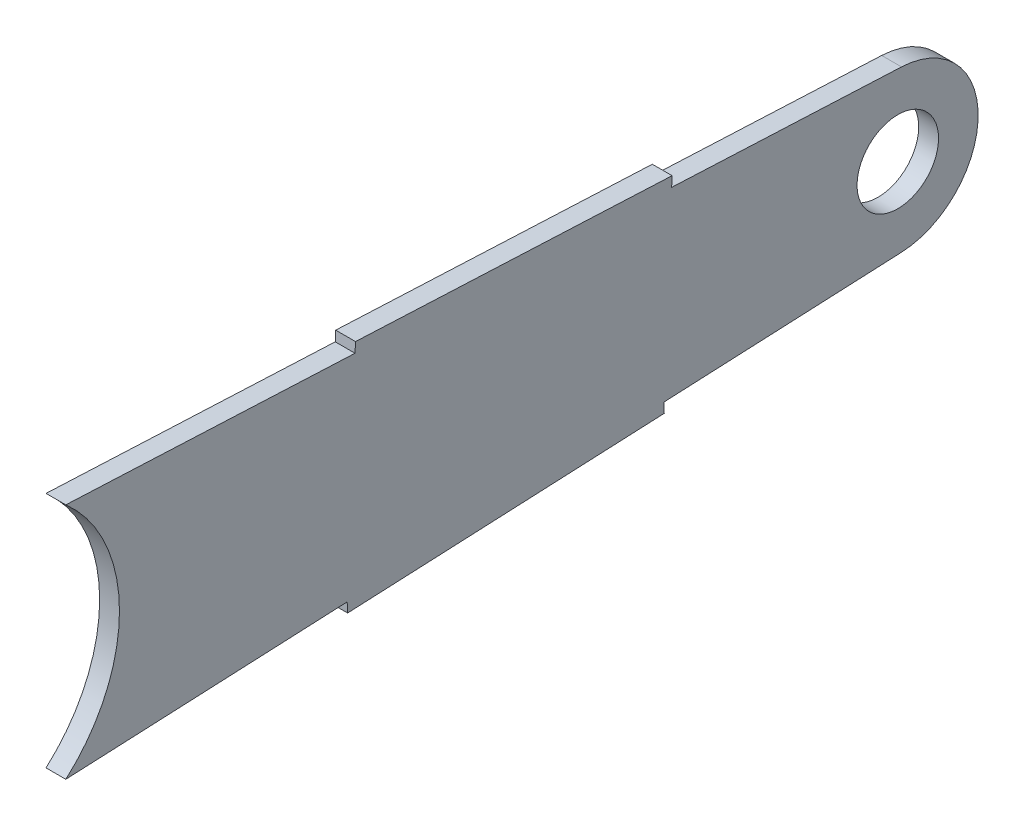
ISO-10303-21;
HEADER;
FILE_DESCRIPTION(('STEP AP214'),'2;1');
FILE_NAME('part.step','',(''),(''),'','','');
FILE_SCHEMA(('AUTOMOTIVE_DESIGN { 1 0 10303 214 1 1 1 1 }'));
ENDSEC;
DATA;
#1=APPLICATION_CONTEXT('core data for automotive mechanical design processes');
#2=APPLICATION_PROTOCOL_DEFINITION('international standard','automotive_design',2000,#1);
#3=PRODUCT_CONTEXT('',#1,'mechanical');
#4=PRODUCT('Part','Part','',(#3));
#5=PRODUCT_RELATED_PRODUCT_CATEGORY('part','',(#4));
#6=PRODUCT_DEFINITION_FORMATION('','',#4);
#7=PRODUCT_DEFINITION_CONTEXT('part definition',#1,'design');
#8=PRODUCT_DEFINITION('design','',#6,#7);
#9=PRODUCT_DEFINITION_SHAPE('','',#8);
#10=(LENGTH_UNIT() NAMED_UNIT(*) SI_UNIT(.MILLI.,.METRE.));
#11=(NAMED_UNIT(*) PLANE_ANGLE_UNIT() SI_UNIT($,.RADIAN.));
#12=(NAMED_UNIT(*) SI_UNIT($,.STERADIAN.) SOLID_ANGLE_UNIT());
#13=UNCERTAINTY_MEASURE_WITH_UNIT(LENGTH_MEASURE(1.E-05),#10,'distance_accuracy_value','');
#14=(GEOMETRIC_REPRESENTATION_CONTEXT(3) GLOBAL_UNCERTAINTY_ASSIGNED_CONTEXT((#13)) GLOBAL_UNIT_ASSIGNED_CONTEXT((#10,
#11,#12)) REPRESENTATION_CONTEXT('',''));
#15=CARTESIAN_POINT('',(0.,0.,0.));
#16=DIRECTION('',(0.,0.,1.));
#17=DIRECTION('',(1.,0.,0.));
#18=AXIS2_PLACEMENT_3D('',#15,#16,#17);
#19=CARTESIAN_POINT('',(0.79375,0.,0.));
#20=DIRECTION('',(-1.,0.,0.));
#21=DIRECTION('',(0.,0.,1.));
#22=AXIS2_PLACEMENT_3D('',#19,#20,#21);
#23=CYLINDRICAL_SURFACE('',#22,3.2639);
#24=CARTESIAN_POINT('',(0.79375,0.,0.));
#25=DIRECTION('',(1.,0.,0.));
#26=DIRECTION('',(0.,0.,-1.));
#27=AXIS2_PLACEMENT_3D('',#24,#25,#26);
#28=CIRCLE('',#27,3.2639);
#29=CARTESIAN_POINT('',(0.79375,0.,-3.2639));
#30=VERTEX_POINT('',#29);
#31=EDGE_CURVE('E203',#30,#30,#28,.T.);
#32=ORIENTED_EDGE('',*,*,#31,.T.);
#33=EDGE_LOOP('',(#32));
#34=FACE_BOUND('',#33,.T.);
#35=CARTESIAN_POINT('',(-0.79375,0.,0.));
#36=DIRECTION('',(1.,0.,0.));
#37=DIRECTION('',(0.,0.,-1.));
#38=AXIS2_PLACEMENT_3D('',#35,#36,#37);
#39=CIRCLE('',#38,3.2639);
#40=CARTESIAN_POINT('',(-0.79375,0.,-3.2639));
#41=VERTEX_POINT('',#40);
#42=EDGE_CURVE('E204',#41,#41,#39,.T.);
#43=ORIENTED_EDGE('',*,*,#42,.F.);
#44=EDGE_LOOP('',(#43));
#45=FACE_BOUND('',#44,.T.);
#46=ADVANCED_FACE('F86',(#34,#45),#23,.F.);
#47=CARTESIAN_POINT('',(0.79375,-6.43204436244265,-0.29704970892038));
#48=DIRECTION('',(0.,-0.998935278144194,-0.0461336111634565));
#49=DIRECTION('',(0.,0.0461336111634565,-0.998935278144194));
#50=AXIS2_PLACEMENT_3D('',#47,#48,#49);
#51=PLANE('',#50);
#52=DIRECTION('',(0.,-0.0461336111634565,0.998935278144194));
#53=VECTOR('',#52,1.);
#54=CARTESIAN_POINT('',(-0.79375,-6.43204436244265,-0.29704970892038));
#55=LINE('',#54,#53);
#56=CARTESIAN_POINT('',(-0.79375,-8.48362010179886,44.1259063559421));
#57=VERTEX_POINT('',#56);
#58=CARTESIAN_POINT('',(-0.79375,-9.52500000000001,66.675));
#59=VERTEX_POINT('',#58);
#60=EDGE_CURVE('E222',#57,#59,#55,.T.);
#61=ORIENTED_EDGE('',*,*,#60,.F.);
#62=DIRECTION('',(-1.,0.,0.));
#63=VECTOR('',#62,1.);
#64=CARTESIAN_POINT('',(0.79375,-8.48362010179886,44.1259063559421));
#65=LINE('',#64,#63);
#66=CARTESIAN_POINT('',(0.79375,-8.48362010179886,44.1259063559421));
#67=VERTEX_POINT('',#66);
#68=EDGE_CURVE('E96',#67,#57,#65,.T.);
#69=ORIENTED_EDGE('',*,*,#68,.F.);
#70=DIRECTION('',(0.,-0.0461336111634565,0.998935278144194));
#71=VECTOR('',#70,1.);
#72=CARTESIAN_POINT('',(0.79375,-6.43204436244265,-0.29704970892038));
#73=LINE('',#72,#71);
#74=CARTESIAN_POINT('',(0.79375,-9.52500000000001,66.675));
#75=VERTEX_POINT('',#74);
#76=EDGE_CURVE('E245',#67,#75,#73,.T.);
#77=ORIENTED_EDGE('',*,*,#76,.T.);
#78=DIRECTION('',(-1.,0.,0.));
#79=VECTOR('',#78,1.);
#80=CARTESIAN_POINT('',(0.79375,-9.52500000000001,66.675));
#81=LINE('',#80,#79);
#82=EDGE_CURVE('E12',#75,#59,#81,.T.);
#83=ORIENTED_EDGE('',*,*,#82,.T.);
#84=EDGE_LOOP('',(#61,#69,#77,#83));
#85=FACE_BOUND('',#84,.T.);
#86=ADVANCED_FACE('F262',(#85),#51,.T.);
#87=CARTESIAN_POINT('',(0.79375,-2.05157573935619,44.4229560648625));
#88=DIRECTION('',(0.,-0.046133611163456,0.998935278144194));
#89=DIRECTION('',(0.,-0.998935278144194,-0.046133611163456));
#90=AXIS2_PLACEMENT_3D('',#87,#88,#89);
#91=PLANE('',#90);
#92=DIRECTION('',(0.,0.998935278144194,0.046133611163456));
#93=VECTOR('',#92,1.);
#94=CARTESIAN_POINT('',(-0.79375,-2.05157573935619,44.4229560648625));
#95=LINE('',#94,#93);
#96=CARTESIAN_POINT('',(-0.79375,-9.27737010179887,44.0892487719503));
#97=VERTEX_POINT('',#96);
#98=EDGE_CURVE('E219',#97,#57,#95,.T.);
#99=ORIENTED_EDGE('',*,*,#98,.F.);
#100=DIRECTION('',(-1.,0.,0.));
#101=VECTOR('',#100,1.);
#102=CARTESIAN_POINT('',(0.79375,-9.27737010179887,44.0892487719503));
#103=LINE('',#102,#101);
#104=CARTESIAN_POINT('',(0.79375,-9.27737010179887,44.0892487719503));
#105=VERTEX_POINT('',#104);
#106=EDGE_CURVE('E185',#105,#97,#103,.T.);
#107=ORIENTED_EDGE('',*,*,#106,.F.);
#108=DIRECTION('',(0.,0.998935278144194,0.046133611163456));
#109=VECTOR('',#108,1.);
#110=CARTESIAN_POINT('',(0.79375,-2.05157573935619,44.4229560648625));
#111=LINE('',#110,#109);
#112=EDGE_CURVE('E242',#105,#67,#111,.T.);
#113=ORIENTED_EDGE('',*,*,#112,.T.);
#114=ORIENTED_EDGE('',*,*,#68,.T.);
#115=EDGE_LOOP('',(#99,#107,#113,#114));
#116=FACE_BOUND('',#115,.T.);
#117=ADVANCED_FACE('F267',(#116),#91,.T.);
#118=CARTESIAN_POINT('',(0.79375,-7.22579436244265,-0.333707292912232));
#119=DIRECTION('',(0.,0.998935278144194,0.0461336111634566));
#120=DIRECTION('',(0.,-0.0461336111634566,0.998935278144194));
#121=AXIS2_PLACEMENT_3D('',#118,#119,#120);
#122=PLANE('',#121);
#123=DIRECTION('',(0.,0.0461336111634566,-0.998935278144194));
#124=VECTOR('',#123,1.);
#125=CARTESIAN_POINT('',(-0.79375,-7.22579436244265,-0.333707292912232));
#126=LINE('',#125,#124);
#127=CARTESIAN_POINT('',(-0.79375,-8.10557637824707,18.7162927070878));
#128=VERTEX_POINT('',#127);
#129=EDGE_CURVE('E217',#97,#128,#126,.T.);
#130=ORIENTED_EDGE('',*,*,#129,.T.);
#131=DIRECTION('',(-1.,0.,0.));
#132=VECTOR('',#131,1.);
#133=CARTESIAN_POINT('',(0.79375,-8.10557637824707,18.7162927070878));
#134=LINE('',#133,#132);
#135=CARTESIAN_POINT('',(0.79375,-8.10557637824707,18.7162927070878));
#136=VERTEX_POINT('',#135);
#137=EDGE_CURVE('E187',#136,#128,#134,.T.);
#138=ORIENTED_EDGE('',*,*,#137,.F.);
#139=DIRECTION('',(0.,0.0461336111634566,-0.998935278144194));
#140=VECTOR('',#139,1.);
#141=CARTESIAN_POINT('',(0.79375,-7.22579436244265,-0.333707292912232));
#142=LINE('',#141,#140);
#143=EDGE_CURVE('E239',#105,#136,#142,.T.);
#144=ORIENTED_EDGE('',*,*,#143,.F.);
#145=ORIENTED_EDGE('',*,*,#106,.T.);
#146=EDGE_LOOP('',(#130,#138,#144,#145));
#147=FACE_BOUND('',#146,.T.);
#148=ADVANCED_FACE('F307',(#147),#122,.F.);
#149=CARTESIAN_POINT('',(0.79375,-0.879782015804408,19.05));
#150=DIRECTION('',(0.,-0.046133611163456,0.998935278144194));
#151=DIRECTION('',(0.,-0.998935278144194,-0.046133611163456));
#152=AXIS2_PLACEMENT_3D('',#149,#150,#151);
#153=PLANE('',#152);
#154=DIRECTION('',(0.,0.998935278144194,0.046133611163456));
#155=VECTOR('',#154,1.);
#156=CARTESIAN_POINT('',(-0.79375,-0.879782015804408,19.05));
#157=LINE('',#156,#155);
#158=CARTESIAN_POINT('',(-0.79375,-7.31182637824707,18.7529502910796));
#159=VERTEX_POINT('',#158);
#160=EDGE_CURVE('E214',#128,#159,#157,.T.);
#161=ORIENTED_EDGE('',*,*,#160,.T.);
#162=DIRECTION('',(-1.,0.,0.));
#163=VECTOR('',#162,1.);
#164=CARTESIAN_POINT('',(0.79375,-7.31182637824707,18.7529502910796));
#165=LINE('',#164,#163);
#166=CARTESIAN_POINT('',(0.79375,-7.31182637824707,18.7529502910796));
#167=VERTEX_POINT('',#166);
#168=EDGE_CURVE('E190',#167,#159,#165,.T.);
#169=ORIENTED_EDGE('',*,*,#168,.F.);
#170=DIRECTION('',(0.,0.998935278144194,0.046133611163456));
#171=VECTOR('',#170,1.);
#172=CARTESIAN_POINT('',(0.79375,-0.879782015804408,19.05));
#173=LINE('',#172,#171);
#174=EDGE_CURVE('E236',#136,#167,#173,.T.);
#175=ORIENTED_EDGE('',*,*,#174,.F.);
#176=ORIENTED_EDGE('',*,*,#137,.T.);
#177=EDGE_LOOP('',(#161,#169,#175,#176));
#178=FACE_BOUND('',#177,.T.);
#179=ADVANCED_FACE('F304',(#178),#153,.F.);
#180=CARTESIAN_POINT('',(-0.79375,-6.43204436244265,-0.29704970892038));
#181=VERTEX_POINT('',#180);
#182=EDGE_CURVE('E213',#181,#159,#55,.T.);
#183=ORIENTED_EDGE('',*,*,#182,.F.);
#184=DIRECTION('',(-1.,0.,0.));
#185=VECTOR('',#184,1.);
#186=CARTESIAN_POINT('',(0.79375,-6.43204436244265,-0.29704970892038));
#187=LINE('',#186,#185);
#188=CARTESIAN_POINT('',(0.79375,-6.43204436244265,-0.29704970892038));
#189=VERTEX_POINT('',#188);
#190=EDGE_CURVE('E192',#189,#181,#187,.T.);
#191=ORIENTED_EDGE('',*,*,#190,.F.);
#192=EDGE_CURVE('E235',#189,#167,#73,.T.);
#193=ORIENTED_EDGE('',*,*,#192,.T.);
#194=ORIENTED_EDGE('',*,*,#168,.T.);
#195=EDGE_LOOP('',(#183,#191,#193,#194));
#196=FACE_BOUND('',#195,.T.);
#197=ADVANCED_FACE('F300',(#196),#51,.T.);
#198=CARTESIAN_POINT('',(0.79375,0.,0.));
#199=DIRECTION('',(-1.,0.,0.));
#200=DIRECTION('',(0.,0.,1.));
#201=AXIS2_PLACEMENT_3D('',#198,#199,#200);
#202=CYLINDRICAL_SURFACE('',#201,6.43890000000001);
#203=CARTESIAN_POINT('',(-0.79375,0.,0.));
#204=DIRECTION('',(1.,0.,0.));
#205=DIRECTION('',(0.,0.,-1.));
#206=AXIS2_PLACEMENT_3D('',#203,#204,#205);
#207=CIRCLE('',#206,6.43890000000001);
#208=CARTESIAN_POINT('',(-0.79375,6.43204436244268,-0.297049708920376));
#209=VERTEX_POINT('',#208);
#210=EDGE_CURVE('E211',#181,#209,#207,.T.);
#211=ORIENTED_EDGE('',*,*,#210,.T.);
#212=DIRECTION('',(-1.,0.,0.));
#213=VECTOR('',#212,1.);
#214=CARTESIAN_POINT('',(0.79375,6.43204436244268,-0.297049708920376));
#215=LINE('',#214,#213);
#216=CARTESIAN_POINT('',(0.79375,6.43204436244268,-0.297049708920376));
#217=VERTEX_POINT('',#216);
#218=EDGE_CURVE('E194',#217,#209,#215,.T.);
#219=ORIENTED_EDGE('',*,*,#218,.F.);
#220=CARTESIAN_POINT('',(0.79375,0.,0.));
#221=DIRECTION('',(1.,0.,0.));
#222=DIRECTION('',(0.,0.,-1.));
#223=AXIS2_PLACEMENT_3D('',#220,#221,#222);
#224=CIRCLE('',#223,6.43890000000001);
#225=EDGE_CURVE('E232',#189,#217,#224,.T.);
#226=ORIENTED_EDGE('',*,*,#225,.F.);
#227=ORIENTED_EDGE('',*,*,#190,.T.);
#228=EDGE_LOOP('',(#211,#219,#226,#227));
#229=FACE_BOUND('',#228,.T.);
#230=ADVANCED_FACE('F294',(#229),#202,.T.);
#231=CARTESIAN_POINT('',(0.79375,6.43204436244268,-0.297049708920377));
#232=DIRECTION('',(0.,-0.998935278144194,0.0461336111634559));
#233=DIRECTION('',(0.,-0.0461336111634559,-0.998935278144194));
#234=AXIS2_PLACEMENT_3D('',#231,#232,#233);
#235=PLANE('',#234);
#236=DIRECTION('',(0.,0.0461336111634559,0.998935278144194));
#237=VECTOR('',#236,1.);
#238=CARTESIAN_POINT('',(-0.79375,6.43204436244268,-0.297049708920377));
#239=LINE('',#238,#237);
#240=CARTESIAN_POINT('',(-0.79375,7.2827188797864,18.1226829797287));
#241=VERTEX_POINT('',#240);
#242=EDGE_CURVE('E208',#209,#241,#239,.T.);
#243=ORIENTED_EDGE('',*,*,#242,.T.);
#244=DIRECTION('',(-1.,0.,0.));
#245=VECTOR('',#244,1.);
#246=CARTESIAN_POINT('',(0.79375,7.2827188797864,18.1226829797287));
#247=LINE('',#246,#245);
#248=CARTESIAN_POINT('',(0.79375,7.2827188797864,18.1226829797287));
#249=VERTEX_POINT('',#248);
#250=EDGE_CURVE('E197',#249,#241,#247,.T.);
#251=ORIENTED_EDGE('',*,*,#250,.F.);
#252=DIRECTION('',(0.,0.0461336111634559,0.998935278144194));
#253=VECTOR('',#252,1.);
#254=CARTESIAN_POINT('',(0.79375,6.43204436244268,-0.297049708920377));
#255=LINE('',#254,#253);
#256=EDGE_CURVE('E229',#217,#249,#255,.T.);
#257=ORIENTED_EDGE('',*,*,#256,.F.);
#258=ORIENTED_EDGE('',*,*,#218,.T.);
#259=EDGE_LOOP('',(#243,#251,#257,#258));
#260=FACE_BOUND('',#259,.T.);
#261=ADVANCED_FACE('F284',(#260),#235,.F.);
#262=CARTESIAN_POINT('',(-0.79375,8.45451260333818,43.4956390445912));
#263=VERTEX_POINT('',#262);
#264=CARTESIAN_POINT('',(-0.79375,9.52499999999999,66.675));
#265=VERTEX_POINT('',#264);
#266=EDGE_CURVE('E172',#263,#265,#239,.T.);
#267=ORIENTED_EDGE('',*,*,#266,.T.);
#268=DIRECTION('',(-1.,0.,0.));
#269=VECTOR('',#268,1.);
#270=CARTESIAN_POINT('',(0.79375,9.52499999999999,66.675));
#271=LINE('',#270,#269);
#272=CARTESIAN_POINT('',(0.79375,9.52499999999999,66.675));
#273=VERTEX_POINT('',#272);
#274=EDGE_CURVE('E201',#273,#265,#271,.T.);
#275=ORIENTED_EDGE('',*,*,#274,.F.);
#276=CARTESIAN_POINT('',(0.79375,8.45451260333818,43.4956390445912));
#277=VERTEX_POINT('',#276);
#278=EDGE_CURVE('E105',#277,#273,#255,.T.);
#279=ORIENTED_EDGE('',*,*,#278,.F.);
#280=DIRECTION('',(-1.,0.,0.));
#281=VECTOR('',#280,1.);
#282=CARTESIAN_POINT('',(0.79375,8.45451260333818,43.4956390445912));
#283=LINE('',#282,#281);
#284=EDGE_CURVE('E199',#277,#263,#283,.T.);
#285=ORIENTED_EDGE('',*,*,#284,.T.);
#286=EDGE_LOOP('',(#267,#275,#279,#285));
#287=FACE_BOUND('',#286,.T.);
#288=ADVANCED_FACE('F325',(#287),#235,.F.);
#289=CARTESIAN_POINT('',(0.79375,0.,75.0752604126301));
#290=DIRECTION('',(-1.,0.,0.));
#291=DIRECTION('',(0.,0.,1.));
#292=AXIS2_PLACEMENT_3D('',#289,#290,#291);
#293=CYLINDRICAL_SURFACE('',#292,12.7);
#294=CARTESIAN_POINT('',(-0.79375,0.,75.0752604126301));
#295=DIRECTION('',(1.,0.,0.));
#296=DIRECTION('',(0.,0.,-1.));
#297=AXIS2_PLACEMENT_3D('',#294,#295,#296);
#298=CIRCLE('',#297,12.7);
#299=EDGE_CURVE('E225',#59,#265,#298,.T.);
#300=ORIENTED_EDGE('',*,*,#299,.F.);
#301=ORIENTED_EDGE('',*,*,#82,.F.);
#302=CARTESIAN_POINT('',(0.79375,0.,75.0752604126301));
#303=DIRECTION('',(1.,0.,0.));
#304=DIRECTION('',(0.,0.,-1.));
#305=AXIS2_PLACEMENT_3D('',#302,#303,#304);
#306=CIRCLE('',#305,12.7);
#307=EDGE_CURVE('E207',#75,#273,#306,.T.);
#308=ORIENTED_EDGE('',*,*,#307,.T.);
#309=ORIENTED_EDGE('',*,*,#274,.T.);
#310=EDGE_LOOP('',(#300,#301,#308,#309));
#311=FACE_BOUND('',#310,.T.);
#312=ADVANCED_FACE('F252',(#311),#293,.F.);
#313=CARTESIAN_POINT('',(-0.79375,0.,0.));
#314=DIRECTION('',(1.,0.,0.));
#315=DIRECTION('',(0.,0.,-1.));
#316=AXIS2_PLACEMENT_3D('',#313,#314,#315);
#317=PLANE('',#316);
#318=DIRECTION('',(0.,-0.998935278144194,0.0461336111634569));
#319=VECTOR('',#318,1.);
#320=CARTESIAN_POINT('',(-0.79375,8.07562375681336,18.0860644258677));
#321=LINE('',#320,#319);
#322=CARTESIAN_POINT('',(-0.79375,8.07562375681336,18.0860644258677));
#323=VERTEX_POINT('',#322);
#324=EDGE_CURVE('E173',#323,#241,#321,.T.);
#325=ORIENTED_EDGE('',*,*,#324,.T.);
#326=ORIENTED_EDGE('',*,*,#242,.F.);
#327=ORIENTED_EDGE('',*,*,#210,.F.);
#328=ORIENTED_EDGE('',*,*,#182,.T.);
#329=ORIENTED_EDGE('',*,*,#160,.F.);
#330=ORIENTED_EDGE('',*,*,#129,.F.);
#331=ORIENTED_EDGE('',*,*,#98,.T.);
#332=ORIENTED_EDGE('',*,*,#60,.T.);
#333=ORIENTED_EDGE('',*,*,#299,.T.);
#334=ORIENTED_EDGE('',*,*,#266,.F.);
#335=DIRECTION('',(0.,-0.998935278144194,0.0461336111634569));
#336=VECTOR('',#335,1.);
#337=CARTESIAN_POINT('',(-0.79375,9.24741748036514,43.4590204907302));
#338=LINE('',#337,#336);
#339=CARTESIAN_POINT('',(-0.79375,9.24741748036514,43.4590204907302));
#340=VERTEX_POINT('',#339);
#341=EDGE_CURVE('E159',#340,#263,#338,.T.);
#342=ORIENTED_EDGE('',*,*,#341,.F.);
#343=DIRECTION('',(0.,-0.0461336111634559,-0.998935278144194));
#344=VECTOR('',#343,1.);
#345=CARTESIAN_POINT('',(-0.79375,9.24741748036514,43.4590204907302));
#346=LINE('',#345,#344);
#347=EDGE_CURVE('E169',#340,#323,#346,.T.);
#348=ORIENTED_EDGE('',*,*,#347,.T.);
#349=EDGE_LOOP('',(#325,#326,#327,#328,#329,#330,#331,#332,#333,#334,#342,#348));
#350=FACE_BOUND('',#349,.T.);
#351=ORIENTED_EDGE('',*,*,#42,.T.);
#352=EDGE_LOOP('',(#351));
#353=FACE_BOUND('',#352,.T.);
#354=ADVANCED_FACE('F167',(#350,#353),#317,.F.);
#355=CARTESIAN_POINT('',(0.79375,0.,0.));
#356=DIRECTION('',(1.,0.,0.));
#357=DIRECTION('',(0.,0.,-1.));
#358=AXIS2_PLACEMENT_3D('',#355,#356,#357);
#359=PLANE('',#358);
#360=ORIENTED_EDGE('',*,*,#256,.T.);
#361=DIRECTION('',(0.,-0.998935278144194,0.0461336111634569));
#362=VECTOR('',#361,1.);
#363=CARTESIAN_POINT('',(0.79375,8.07562375681336,18.0860644258677));
#364=LINE('',#363,#362);
#365=CARTESIAN_POINT('',(0.79375,8.07562375681336,18.0860644258677));
#366=VERTEX_POINT('',#365);
#367=EDGE_CURVE('E177',#366,#249,#364,.T.);
#368=ORIENTED_EDGE('',*,*,#367,.F.);
#369=DIRECTION('',(0.,-0.0461336111634559,-0.998935278144194));
#370=VECTOR('',#369,1.);
#371=CARTESIAN_POINT('',(0.79375,9.24741748036514,43.4590204907302));
#372=LINE('',#371,#370);
#373=CARTESIAN_POINT('',(0.79375,9.24741748036514,43.4590204907302));
#374=VERTEX_POINT('',#373);
#375=EDGE_CURVE('E163',#374,#366,#372,.T.);
#376=ORIENTED_EDGE('',*,*,#375,.F.);
#377=DIRECTION('',(0.,-0.998935278144194,0.0461336111634569));
#378=VECTOR('',#377,1.);
#379=CARTESIAN_POINT('',(0.79375,9.24741748036514,43.4590204907302));
#380=LINE('',#379,#378);
#381=EDGE_CURVE('E161',#374,#277,#380,.T.);
#382=ORIENTED_EDGE('',*,*,#381,.T.);
#383=ORIENTED_EDGE('',*,*,#278,.T.);
#384=ORIENTED_EDGE('',*,*,#307,.F.);
#385=ORIENTED_EDGE('',*,*,#76,.F.);
#386=ORIENTED_EDGE('',*,*,#112,.F.);
#387=ORIENTED_EDGE('',*,*,#143,.T.);
#388=ORIENTED_EDGE('',*,*,#174,.T.);
#389=ORIENTED_EDGE('',*,*,#192,.F.);
#390=ORIENTED_EDGE('',*,*,#225,.T.);
#391=EDGE_LOOP('',(#360,#368,#376,#382,#383,#384,#385,#386,#387,#388,#389,#390));
#392=FACE_BOUND('',#391,.T.);
#393=ORIENTED_EDGE('',*,*,#31,.F.);
#394=EDGE_LOOP('',(#393));
#395=FACE_BOUND('',#394,.T.);
#396=ADVANCED_FACE('F254',(#392,#395),#359,.T.);
#397=CARTESIAN_POINT('',(0.79375,8.07562375681336,18.0860644258677));
#398=DIRECTION('',(0.,-0.0461336111634569,-0.998935278144194));
#399=DIRECTION('',(0.,0.998935278144194,-0.0461336111634569));
#400=AXIS2_PLACEMENT_3D('',#397,#398,#399);
#401=PLANE('',#400);
#402=ORIENTED_EDGE('',*,*,#250,.T.);
#403=ORIENTED_EDGE('',*,*,#324,.F.);
#404=DIRECTION('',(-1.,0.,0.));
#405=VECTOR('',#404,1.);
#406=CARTESIAN_POINT('',(0.79375,8.07562375681336,18.0860644258677));
#407=LINE('',#406,#405);
#408=EDGE_CURVE('E90',#366,#323,#407,.T.);
#409=ORIENTED_EDGE('',*,*,#408,.F.);
#410=ORIENTED_EDGE('',*,*,#367,.T.);
#411=EDGE_LOOP('',(#402,#403,#409,#410));
#412=FACE_BOUND('',#411,.T.);
#413=ADVANCED_FACE('F288',(#412),#401,.T.);
#414=CARTESIAN_POINT('',(0.79375,9.24741748036514,43.4590204907302));
#415=DIRECTION('',(0.,0.998935278144194,-0.0461336111634559));
#416=DIRECTION('',(0.,0.0461336111634559,0.998935278144194));
#417=AXIS2_PLACEMENT_3D('',#414,#415,#416);
#418=PLANE('',#417);
#419=ORIENTED_EDGE('',*,*,#347,.F.);
#420=DIRECTION('',(-1.,0.,0.));
#421=VECTOR('',#420,1.);
#422=CARTESIAN_POINT('',(0.79375,9.24741748036514,43.4590204907302));
#423=LINE('',#422,#421);
#424=EDGE_CURVE('E157',#374,#340,#423,.T.);
#425=ORIENTED_EDGE('',*,*,#424,.F.);
#426=ORIENTED_EDGE('',*,*,#375,.T.);
#427=ORIENTED_EDGE('',*,*,#408,.T.);
#428=EDGE_LOOP('',(#419,#425,#426,#427));
#429=FACE_BOUND('',#428,.T.);
#430=ADVANCED_FACE('F175',(#429),#418,.T.);
#431=CARTESIAN_POINT('',(0.79375,9.24741748036514,43.4590204907302));
#432=DIRECTION('',(0.,-0.0461336111634569,-0.998935278144194));
#433=DIRECTION('',(0.,0.998935278144194,-0.0461336111634569));
#434=AXIS2_PLACEMENT_3D('',#431,#432,#433);
#435=PLANE('',#434);
#436=ORIENTED_EDGE('',*,*,#341,.T.);
#437=ORIENTED_EDGE('',*,*,#284,.F.);
#438=ORIENTED_EDGE('',*,*,#381,.F.);
#439=ORIENTED_EDGE('',*,*,#424,.T.);
#440=EDGE_LOOP('',(#436,#437,#438,#439));
#441=FACE_BOUND('',#440,.T.);
#442=ADVANCED_FACE('F88',(#441),#435,.F.);
#443=CLOSED_SHELL('',(#46,#86,#117,#148,#179,#197,#230,#261,#288,#312,#354,#396,#413,#430,#442));
#444=MANIFOLD_SOLID_BREP('B2',#443);
#445=ADVANCED_BREP_SHAPE_REPRESENTATION('',(#18,#444),#14);
#446=SHAPE_DEFINITION_REPRESENTATION(#9,#445);
ENDSEC;
END-ISO-10303-21;
